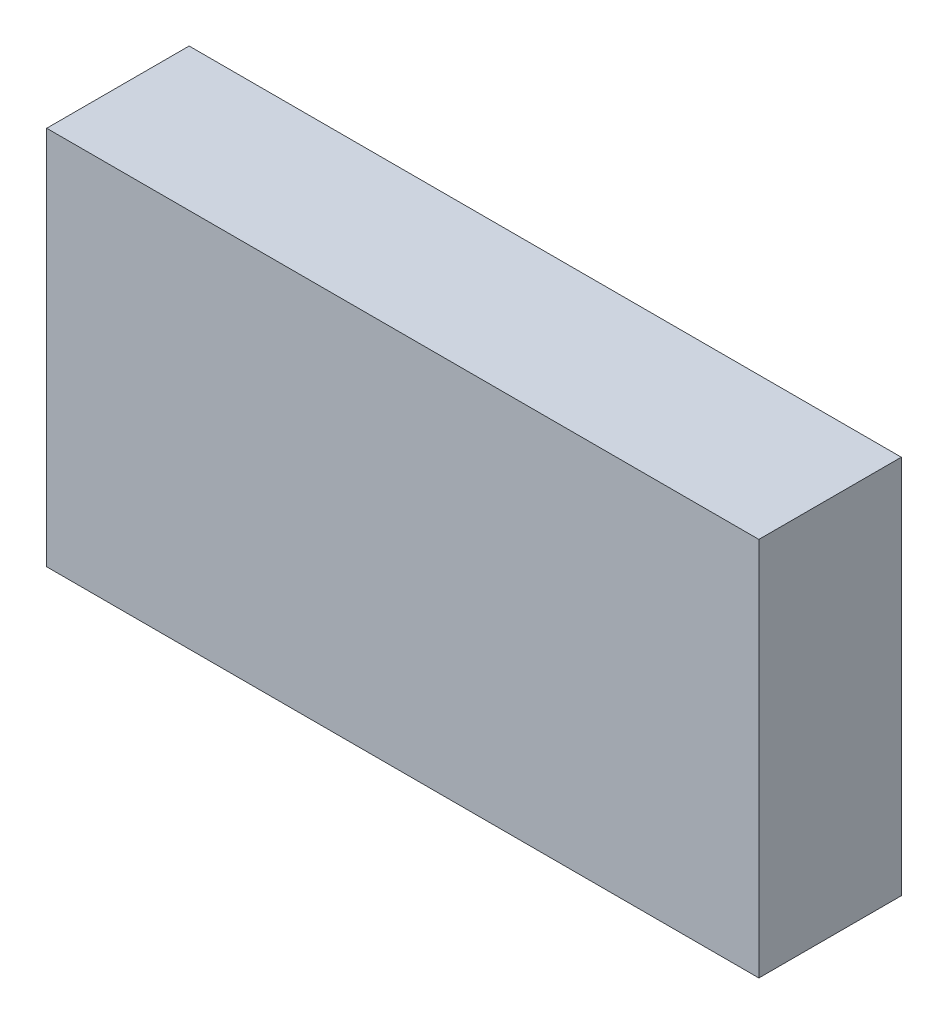
ISO-10303-21;
HEADER;
FILE_DESCRIPTION(('STEP AP214'),'2;1');
FILE_NAME('part.step','',(''),(''),'','','');
FILE_SCHEMA(('AUTOMOTIVE_DESIGN { 1 0 10303 214 1 1 1 1 }'));
ENDSEC;
DATA;
#1=APPLICATION_CONTEXT('core data for automotive mechanical design processes');
#2=APPLICATION_PROTOCOL_DEFINITION('international standard','automotive_design',2000,#1);
#3=PRODUCT_CONTEXT('',#1,'mechanical');
#4=PRODUCT('Part','Part','',(#3));
#5=PRODUCT_RELATED_PRODUCT_CATEGORY('part','',(#4));
#6=PRODUCT_DEFINITION_FORMATION('','',#4);
#7=PRODUCT_DEFINITION_CONTEXT('part definition',#1,'design');
#8=PRODUCT_DEFINITION('design','',#6,#7);
#9=PRODUCT_DEFINITION_SHAPE('','',#8);
#10=(LENGTH_UNIT() NAMED_UNIT(*) SI_UNIT(.MILLI.,.METRE.));
#11=(NAMED_UNIT(*) PLANE_ANGLE_UNIT() SI_UNIT($,.RADIAN.));
#12=(NAMED_UNIT(*) SI_UNIT($,.STERADIAN.) SOLID_ANGLE_UNIT());
#13=UNCERTAINTY_MEASURE_WITH_UNIT(LENGTH_MEASURE(1.E-05),#10,'distance_accuracy_value','');
#14=(GEOMETRIC_REPRESENTATION_CONTEXT(3) GLOBAL_UNCERTAINTY_ASSIGNED_CONTEXT((#13)) GLOBAL_UNIT_ASSIGNED_CONTEXT((#10,
#11,#12)) REPRESENTATION_CONTEXT('',''));
#15=CARTESIAN_POINT('',(0.,0.,0.));
#16=DIRECTION('',(0.,0.,1.));
#17=DIRECTION('',(1.,0.,0.));
#18=AXIS2_PLACEMENT_3D('',#15,#16,#17);
#19=CARTESIAN_POINT('',(596.,74.,-3.));
#20=DIRECTION('',(-1.,0.,0.));
#21=DIRECTION('',(0.,0.,1.));
#22=AXIS2_PLACEMENT_3D('',#19,#20,#21);
#23=PLANE('',#22);
#24=DIRECTION('',(0.,-1.,0.));
#25=VECTOR('',#24,1.);
#26=CARTESIAN_POINT('',(596.,74.,0.));
#27=LINE('',#26,#25);
#28=CARTESIAN_POINT('',(596.,82.,0.));
#29=VERTEX_POINT('',#28);
#30=CARTESIAN_POINT('',(596.,74.,0.));
#31=VERTEX_POINT('',#30);
#32=EDGE_CURVE('E103',#29,#31,#27,.T.);
#33=ORIENTED_EDGE('',*,*,#32,.F.);
#34=DIRECTION('',(0.,0.,1.));
#35=VECTOR('',#34,1.);
#36=CARTESIAN_POINT('',(596.,82.,-3.));
#37=LINE('',#36,#35);
#38=CARTESIAN_POINT('',(596.,82.,-3.));
#39=VERTEX_POINT('',#38);
#40=EDGE_CURVE('E11',#39,#29,#37,.T.);
#41=ORIENTED_EDGE('',*,*,#40,.F.);
#42=DIRECTION('',(0.,-1.,0.));
#43=VECTOR('',#42,1.);
#44=CARTESIAN_POINT('',(596.,74.,-3.));
#45=LINE('',#44,#43);
#46=CARTESIAN_POINT('',(596.,74.,-3.));
#47=VERTEX_POINT('',#46);
#48=EDGE_CURVE('E97',#39,#47,#45,.T.);
#49=ORIENTED_EDGE('',*,*,#48,.T.);
#50=DIRECTION('',(0.,0.,1.));
#51=VECTOR('',#50,1.);
#52=CARTESIAN_POINT('',(596.,74.,-3.));
#53=LINE('',#52,#51);
#54=EDGE_CURVE('E42',#47,#31,#53,.T.);
#55=ORIENTED_EDGE('',*,*,#54,.T.);
#56=EDGE_LOOP('',(#33,#41,#49,#55));
#57=FACE_BOUND('',#56,.T.);
#58=ADVANCED_FACE('F39',(#57),#23,.T.);
#59=CARTESIAN_POINT('',(596.,82.,-3.));
#60=DIRECTION('',(0.,1.,0.));
#61=DIRECTION('',(0.,0.,1.));
#62=AXIS2_PLACEMENT_3D('',#59,#60,#61);
#63=PLANE('',#62);
#64=DIRECTION('',(-1.,0.,0.));
#65=VECTOR('',#64,1.);
#66=CARTESIAN_POINT('',(596.,82.,0.));
#67=LINE('',#66,#65);
#68=CARTESIAN_POINT('',(611.,82.,0.));
#69=VERTEX_POINT('',#68);
#70=EDGE_CURVE('E99',#69,#29,#67,.T.);
#71=ORIENTED_EDGE('',*,*,#70,.F.);
#72=DIRECTION('',(0.,0.,1.));
#73=VECTOR('',#72,1.);
#74=CARTESIAN_POINT('',(611.,82.,-3.));
#75=LINE('',#74,#73);
#76=CARTESIAN_POINT('',(611.,82.,-3.));
#77=VERTEX_POINT('',#76);
#78=EDGE_CURVE('E48',#77,#69,#75,.T.);
#79=ORIENTED_EDGE('',*,*,#78,.F.);
#80=DIRECTION('',(-1.,0.,0.));
#81=VECTOR('',#80,1.);
#82=CARTESIAN_POINT('',(596.,82.,-3.));
#83=LINE('',#82,#81);
#84=EDGE_CURVE('E94',#77,#39,#83,.T.);
#85=ORIENTED_EDGE('',*,*,#84,.T.);
#86=ORIENTED_EDGE('',*,*,#40,.T.);
#87=EDGE_LOOP('',(#71,#79,#85,#86));
#88=FACE_BOUND('',#87,.T.);
#89=ADVANCED_FACE('F113',(#88),#63,.T.);
#90=CARTESIAN_POINT('',(611.,74.,-3.));
#91=DIRECTION('',(1.,0.,0.));
#92=DIRECTION('',(0.,0.,-1.));
#93=AXIS2_PLACEMENT_3D('',#90,#91,#92);
#94=PLANE('',#93);
#95=DIRECTION('',(0.,1.,0.));
#96=VECTOR('',#95,1.);
#97=CARTESIAN_POINT('',(611.,74.,0.));
#98=LINE('',#97,#96);
#99=CARTESIAN_POINT('',(611.,74.,0.));
#100=VERTEX_POINT('',#99);
#101=EDGE_CURVE('E89',#100,#69,#98,.T.);
#102=ORIENTED_EDGE('',*,*,#101,.F.);
#103=DIRECTION('',(0.,0.,1.));
#104=VECTOR('',#103,1.);
#105=CARTESIAN_POINT('',(611.,74.,-3.));
#106=LINE('',#105,#104);
#107=CARTESIAN_POINT('',(611.,74.,-3.));
#108=VERTEX_POINT('',#107);
#109=EDGE_CURVE('E84',#108,#100,#106,.T.);
#110=ORIENTED_EDGE('',*,*,#109,.F.);
#111=DIRECTION('',(0.,1.,0.));
#112=VECTOR('',#111,1.);
#113=CARTESIAN_POINT('',(611.,74.,-3.));
#114=LINE('',#113,#112);
#115=EDGE_CURVE('E87',#108,#77,#114,.T.);
#116=ORIENTED_EDGE('',*,*,#115,.T.);
#117=ORIENTED_EDGE('',*,*,#78,.T.);
#118=EDGE_LOOP('',(#102,#110,#116,#117));
#119=FACE_BOUND('',#118,.T.);
#120=ADVANCED_FACE('F86',(#119),#94,.T.);
#121=CARTESIAN_POINT('',(596.,74.,-3.));
#122=DIRECTION('',(0.,-1.,0.));
#123=DIRECTION('',(0.,0.,-1.));
#124=AXIS2_PLACEMENT_3D('',#121,#122,#123);
#125=PLANE('',#124);
#126=DIRECTION('',(1.,0.,0.));
#127=VECTOR('',#126,1.);
#128=CARTESIAN_POINT('',(596.,74.,0.));
#129=LINE('',#128,#127);
#130=EDGE_CURVE('E106',#31,#100,#129,.T.);
#131=ORIENTED_EDGE('',*,*,#130,.F.);
#132=ORIENTED_EDGE('',*,*,#54,.F.);
#133=DIRECTION('',(1.,0.,0.));
#134=VECTOR('',#133,1.);
#135=CARTESIAN_POINT('',(596.,74.,-3.));
#136=LINE('',#135,#134);
#137=EDGE_CURVE('E93',#47,#108,#136,.T.);
#138=ORIENTED_EDGE('',*,*,#137,.T.);
#139=ORIENTED_EDGE('',*,*,#109,.T.);
#140=EDGE_LOOP('',(#131,#132,#138,#139));
#141=FACE_BOUND('',#140,.T.);
#142=ADVANCED_FACE('F96',(#141),#125,.T.);
#143=CARTESIAN_POINT('',(0.,0.,-3.));
#144=DIRECTION('',(0.,0.,-1.));
#145=DIRECTION('',(-1.,0.,0.));
#146=AXIS2_PLACEMENT_3D('',#143,#144,#145);
#147=PLANE('',#146);
#148=ORIENTED_EDGE('',*,*,#48,.F.);
#149=ORIENTED_EDGE('',*,*,#84,.F.);
#150=ORIENTED_EDGE('',*,*,#115,.F.);
#151=ORIENTED_EDGE('',*,*,#137,.F.);
#152=EDGE_LOOP('',(#148,#149,#150,#151));
#153=FACE_BOUND('',#152,.T.);
#154=ADVANCED_FACE('F92',(#153),#147,.T.);
#155=CARTESIAN_POINT('',(0.,0.,0.));
#156=DIRECTION('',(0.,0.,-1.));
#157=DIRECTION('',(-1.,0.,0.));
#158=AXIS2_PLACEMENT_3D('',#155,#156,#157);
#159=PLANE('',#158);
#160=ORIENTED_EDGE('',*,*,#32,.T.);
#161=ORIENTED_EDGE('',*,*,#130,.T.);
#162=ORIENTED_EDGE('',*,*,#101,.T.);
#163=ORIENTED_EDGE('',*,*,#70,.T.);
#164=EDGE_LOOP('',(#160,#161,#162,#163));
#165=FACE_BOUND('',#164,.T.);
#166=ADVANCED_FACE('F112',(#165),#159,.F.);
#167=CLOSED_SHELL('',(#58,#89,#120,#142,#154,#166));
#168=MANIFOLD_SOLID_BREP('B2',#167);
#169=ADVANCED_BREP_SHAPE_REPRESENTATION('',(#18,#168),#14);
#170=SHAPE_DEFINITION_REPRESENTATION(#9,#169);
ENDSEC;
END-ISO-10303-21;
